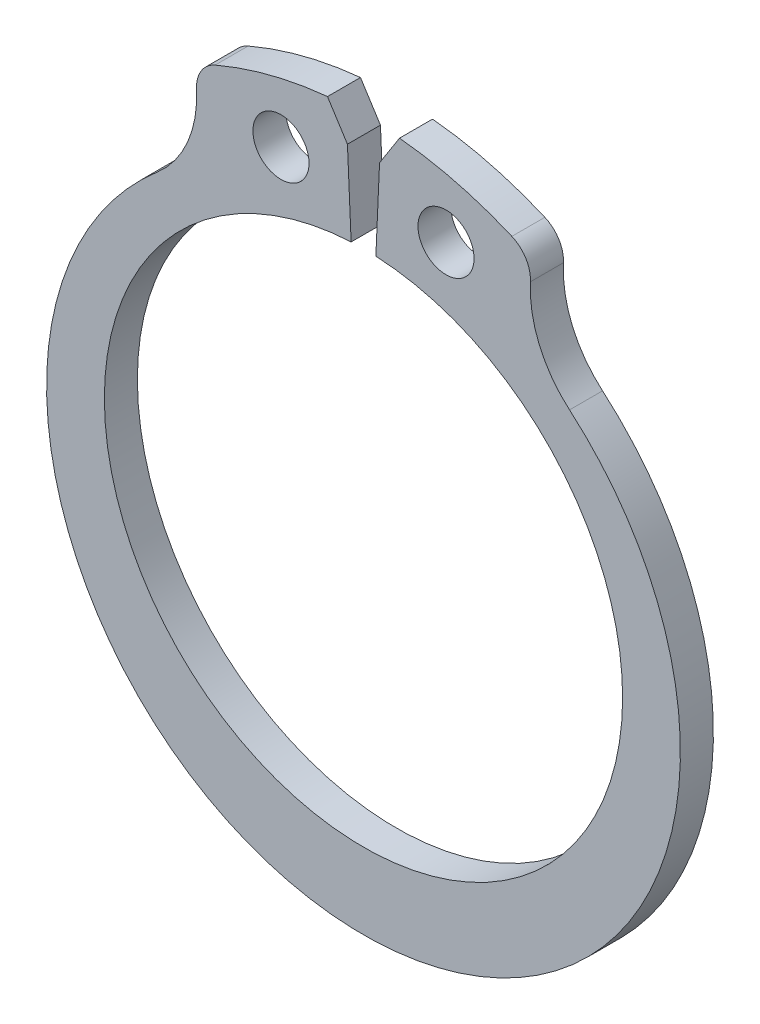
ISO-10303-21;
HEADER;
FILE_DESCRIPTION(('STEP AP214'),'2;1');
FILE_NAME('part.step','',(''),(''),'','','');
FILE_SCHEMA(('AUTOMOTIVE_DESIGN { 1 0 10303 214 1 1 1 1 }'));
ENDSEC;
DATA;
#1=APPLICATION_CONTEXT('core data for automotive mechanical design processes');
#2=APPLICATION_PROTOCOL_DEFINITION('international standard','automotive_design',2000,#1);
#3=PRODUCT_CONTEXT('',#1,'mechanical');
#4=PRODUCT('Part','Part','',(#3));
#5=PRODUCT_RELATED_PRODUCT_CATEGORY('part','',(#4));
#6=PRODUCT_DEFINITION_FORMATION('','',#4);
#7=PRODUCT_DEFINITION_CONTEXT('part definition',#1,'design');
#8=PRODUCT_DEFINITION('design','',#6,#7);
#9=PRODUCT_DEFINITION_SHAPE('','',#8);
#10=(LENGTH_UNIT() NAMED_UNIT(*) SI_UNIT(.MILLI.,.METRE.));
#11=(NAMED_UNIT(*) PLANE_ANGLE_UNIT() SI_UNIT($,.RADIAN.));
#12=(NAMED_UNIT(*) SI_UNIT($,.STERADIAN.) SOLID_ANGLE_UNIT());
#13=UNCERTAINTY_MEASURE_WITH_UNIT(LENGTH_MEASURE(1.E-05),#10,'distance_accuracy_value','');
#14=(GEOMETRIC_REPRESENTATION_CONTEXT(3) GLOBAL_UNCERTAINTY_ASSIGNED_CONTEXT((#13)) GLOBAL_UNIT_ASSIGNED_CONTEXT((#10,
#11,#12)) REPRESENTATION_CONTEXT('',''));
#15=CARTESIAN_POINT('',(0.,0.,0.));
#16=DIRECTION('',(0.,0.,1.));
#17=DIRECTION('',(1.,0.,0.));
#18=AXIS2_PLACEMENT_3D('',#15,#16,#17);
#19=CARTESIAN_POINT('',(3.58737884970706,0.376444434341003,1.));
#20=DIRECTION('',(0.,0.,1.));
#21=DIRECTION('',(1.,0.,0.));
#22=AXIS2_PLACEMENT_3D('',#19,#20,#21);
#23=PLANE('',#22);
#24=CARTESIAN_POINT('',(2.5,9.268764750494,1.));
#25=DIRECTION('',(0.,0.,-1.));
#26=DIRECTION('',(1.,0.,0.));
#27=AXIS2_PLACEMENT_3D('',#24,#25,#26);
#28=CIRCLE('',#27,0.85);
#29=CARTESIAN_POINT('',(1.65,9.268764750494,1.));
#30=VERTEX_POINT('',#29);
#31=EDGE_CURVE('E46',#30,#30,#28,.T.);
#32=ORIENTED_EDGE('',*,*,#31,.T.);
#33=EDGE_LOOP('',(#32));
#34=FACE_BOUND('',#33,.T.);
#35=CARTESIAN_POINT('',(-2.5,9.268764750494,1.));
#36=DIRECTION('',(0.,0.,-1.));
#37=DIRECTION('',(-1.,0.,0.));
#38=AXIS2_PLACEMENT_3D('',#35,#36,#37);
#39=CIRCLE('',#38,0.85);
#40=CARTESIAN_POINT('',(-1.65,9.268764750494,1.));
#41=VERTEX_POINT('',#40);
#42=EDGE_CURVE('E173',#41,#41,#39,.T.);
#43=ORIENTED_EDGE('',*,*,#42,.T.);
#44=EDGE_LOOP('',(#43));
#45=FACE_BOUND('',#44,.T.);
#46=CARTESIAN_POINT('',(0.,0.,1.));
#47=DIRECTION('',(0.,0.,-1.));
#48=DIRECTION('',(1.,0.,0.));
#49=AXIS2_PLACEMENT_3D('',#46,#47,#48);
#50=CIRCLE('',#49,7.85);
#51=CARTESIAN_POINT('',(0.374496199068514,7.84106195593959,1.));
#52=VERTEX_POINT('',#51);
#53=CARTESIAN_POINT('',(-0.374496199068514,7.84106195593959,1.));
#54=VERTEX_POINT('',#53);
#55=EDGE_CURVE('E150',#52,#54,#50,.T.);
#56=ORIENTED_EDGE('',*,*,#55,.T.);
#57=DIRECTION('',(-0.0445859872611464,0.999005550404976,0.));
#58=VECTOR('',#57,1.);
#59=CARTESIAN_POINT('',(0.,-0.55,1.));
#60=LINE('',#59,#58);
#61=CARTESIAN_POINT('',(-0.486471032067326,10.35,1.));
#62=VERTEX_POINT('',#61);
#63=EDGE_CURVE('E137',#54,#62,#60,.T.);
#64=ORIENTED_EDGE('',*,*,#63,.T.);
#65=DIRECTION('',(-0.53811537282345,0.842871191541792,0.));
#66=VECTOR('',#65,1.);
#67=CARTESIAN_POINT('',(-0.486471032067326,10.35,1.));
#68=LINE('',#67,#66);
#69=CARTESIAN_POINT('',(-1.09132810973727,11.2974113387491,1.));
#70=VERTEX_POINT('',#69);
#71=EDGE_CURVE('E66',#62,#70,#68,.T.);
#72=ORIENTED_EDGE('',*,*,#71,.T.);
#73=CARTESIAN_POINT('',(0.,0.,1.));
#74=DIRECTION('',(0.,0.,-1.));
#75=DIRECTION('',(-1.,0.,0.));
#76=AXIS2_PLACEMENT_3D('',#73,#74,#75);
#77=CIRCLE('',#76,11.35);
#78=CARTESIAN_POINT('',(-4.49406741142332,10.4223729592441,1.));
#79=VERTEX_POINT('',#78);
#80=EDGE_CURVE('E206',#79,#70,#77,.T.);
#81=ORIENTED_EDGE('',*,*,#80,.F.);
#82=CARTESIAN_POINT('',(-4.12385128546025,9.56378981238127,1.));
#83=DIRECTION('',(0.,0.,-1.));
#84=DIRECTION('',(-1.,0.,0.));
#85=AXIS2_PLACEMENT_3D('',#82,#83,#84);
#86=CIRCLE('',#85,0.935);
#87=CARTESIAN_POINT('',(-5.05745661579865,9.51273996258983,1.));
#88=VERTEX_POINT('',#87);
#89=EDGE_CURVE('E165',#88,#79,#86,.T.);
#90=ORIENTED_EDGE('',*,*,#89,.F.);
#91=CARTESIAN_POINT('',(-8.45238508975646,9.32710414516637,1.));
#92=DIRECTION('',(0.,0.,-1.));
#93=DIRECTION('',(-1.,0.,0.));
#94=AXIS2_PLACEMENT_3D('',#91,#92,#93);
#95=CIRCLE('',#94,3.4);
#96=CARTESIAN_POINT('',(-6.24176129705093,6.74386152258439,1.));
#97=VERTEX_POINT('',#96);
#98=EDGE_CURVE('E164',#88,#97,#95,.T.);
#99=ORIENTED_EDGE('',*,*,#98,.T.);
#100=CARTESIAN_POINT('',(0.,-0.55,1.));
#101=DIRECTION('',(0.,0.,-1.));
#102=DIRECTION('',(1.,0.,0.));
#103=AXIS2_PLACEMENT_3D('',#100,#101,#102);
#104=CIRCLE('',#103,9.6);
#105=CARTESIAN_POINT('',(6.24176129705093,6.74386152258439,1.));
#106=VERTEX_POINT('',#105);
#107=EDGE_CURVE('E11',#106,#97,#104,.T.);
#108=ORIENTED_EDGE('',*,*,#107,.F.);
#109=CARTESIAN_POINT('',(8.45238508975646,9.32710414516637,1.));
#110=DIRECTION('',(0.,0.,1.));
#111=DIRECTION('',(1.,0.,0.));
#112=AXIS2_PLACEMENT_3D('',#109,#110,#111);
#113=CIRCLE('',#112,3.4);
#114=CARTESIAN_POINT('',(5.05745661579865,9.51273996258983,1.));
#115=VERTEX_POINT('',#114);
#116=EDGE_CURVE('E166',#115,#106,#113,.T.);
#117=ORIENTED_EDGE('',*,*,#116,.F.);
#118=CARTESIAN_POINT('',(4.12385128546025,9.56378981238127,1.));
#119=DIRECTION('',(0.,0.,-1.));
#120=DIRECTION('',(1.,0.,0.));
#121=AXIS2_PLACEMENT_3D('',#118,#119,#120);
#122=CIRCLE('',#121,0.935);
#123=CARTESIAN_POINT('',(4.49406741142332,10.4223729592441,1.));
#124=VERTEX_POINT('',#123);
#125=EDGE_CURVE('E197',#124,#115,#122,.T.);
#126=ORIENTED_EDGE('',*,*,#125,.F.);
#127=CARTESIAN_POINT('',(0.,0.,1.));
#128=DIRECTION('',(0.,0.,-1.));
#129=DIRECTION('',(1.,0.,0.));
#130=AXIS2_PLACEMENT_3D('',#127,#128,#129);
#131=CIRCLE('',#130,11.35);
#132=CARTESIAN_POINT('',(1.09132810973727,11.2974113387491,1.));
#133=VERTEX_POINT('',#132);
#134=EDGE_CURVE('E205',#133,#124,#131,.T.);
#135=ORIENTED_EDGE('',*,*,#134,.F.);
#136=DIRECTION('',(0.53811537282345,0.842871191541792,0.));
#137=VECTOR('',#136,1.);
#138=CARTESIAN_POINT('',(0.486471032067326,10.35,1.));
#139=LINE('',#138,#137);
#140=CARTESIAN_POINT('',(0.486471032067326,10.35,1.));
#141=VERTEX_POINT('',#140);
#142=EDGE_CURVE('E157',#141,#133,#139,.T.);
#143=ORIENTED_EDGE('',*,*,#142,.F.);
#144=DIRECTION('',(0.0445859872611464,0.999005550404976,0.));
#145=VECTOR('',#144,1.);
#146=CARTESIAN_POINT('',(0.,-0.55,1.));
#147=LINE('',#146,#145);
#148=EDGE_CURVE('E158',#52,#141,#147,.T.);
#149=ORIENTED_EDGE('',*,*,#148,.F.);
#150=EDGE_LOOP('',(#56,#64,#72,#81,#90,#99,#108,#117,#126,#135,#143,#149));
#151=FACE_BOUND('',#150,.T.);
#152=ADVANCED_FACE('F17',(#34,#45,#151),#23,.T.);
#153=CARTESIAN_POINT('',(0.,-0.55,0.));
#154=DIRECTION('',(0.,0.,-1.));
#155=DIRECTION('',(1.,0.,0.));
#156=AXIS2_PLACEMENT_3D('',#153,#154,#155);
#157=CYLINDRICAL_SURFACE('',#156,9.6);
#158=ORIENTED_EDGE('',*,*,#107,.T.);
#159=DIRECTION('',(0.,0.,-1.));
#160=VECTOR('',#159,1.);
#161=CARTESIAN_POINT('',(-6.24176129705093,6.74386152258439,1.));
#162=LINE('',#161,#160);
#163=CARTESIAN_POINT('',(-6.24176129705093,6.74386152258439,0.));
#164=VERTEX_POINT('',#163);
#165=EDGE_CURVE('E162',#97,#164,#162,.T.);
#166=ORIENTED_EDGE('',*,*,#165,.T.);
#167=CARTESIAN_POINT('',(0.,-0.55,0.));
#168=DIRECTION('',(0.,0.,1.));
#169=DIRECTION('',(1.,0.,0.));
#170=AXIS2_PLACEMENT_3D('',#167,#168,#169);
#171=CIRCLE('',#170,9.6);
#172=CARTESIAN_POINT('',(6.24176129705093,6.74386152258439,0.));
#173=VERTEX_POINT('',#172);
#174=EDGE_CURVE('E223',#164,#173,#171,.T.);
#175=ORIENTED_EDGE('',*,*,#174,.T.);
#176=DIRECTION('',(0.,0.,1.));
#177=VECTOR('',#176,1.);
#178=CARTESIAN_POINT('',(6.24176129705093,6.74386152258439,0.));
#179=LINE('',#178,#177);
#180=EDGE_CURVE('E27',#173,#106,#179,.T.);
#181=ORIENTED_EDGE('',*,*,#180,.T.);
#182=EDGE_LOOP('',(#158,#166,#175,#181));
#183=FACE_BOUND('',#182,.T.);
#184=ADVANCED_FACE('F251',(#183),#157,.T.);
#185=CARTESIAN_POINT('',(8.45238508975646,9.32710414516637,0.));
#186=DIRECTION('',(0.,0.,-1.));
#187=DIRECTION('',(1.,0.,0.));
#188=AXIS2_PLACEMENT_3D('',#185,#186,#187);
#189=CYLINDRICAL_SURFACE('',#188,3.4);
#190=ORIENTED_EDGE('',*,*,#116,.T.);
#191=ORIENTED_EDGE('',*,*,#180,.F.);
#192=CARTESIAN_POINT('',(8.45238508975646,9.32710414516637,0.));
#193=DIRECTION('',(0.,0.,1.));
#194=DIRECTION('',(1.,0.,0.));
#195=AXIS2_PLACEMENT_3D('',#192,#193,#194);
#196=CIRCLE('',#195,3.4);
#197=CARTESIAN_POINT('',(5.05745661579865,9.51273996258983,0.));
#198=VERTEX_POINT('',#197);
#199=EDGE_CURVE('E183',#198,#173,#196,.T.);
#200=ORIENTED_EDGE('',*,*,#199,.F.);
#201=DIRECTION('',(0.,0.,1.));
#202=VECTOR('',#201,1.);
#203=CARTESIAN_POINT('',(5.05745661579865,9.51273996258983,0.));
#204=LINE('',#203,#202);
#205=EDGE_CURVE('E169',#198,#115,#204,.T.);
#206=ORIENTED_EDGE('',*,*,#205,.T.);
#207=EDGE_LOOP('',(#190,#191,#200,#206));
#208=FACE_BOUND('',#207,.T.);
#209=ADVANCED_FACE('F247',(#208),#189,.F.);
#210=CARTESIAN_POINT('',(4.12385128546025,9.56378981238127,0.));
#211=DIRECTION('',(0.,0.,-1.));
#212=DIRECTION('',(1.,0.,0.));
#213=AXIS2_PLACEMENT_3D('',#210,#211,#212);
#214=CYLINDRICAL_SURFACE('',#213,0.935);
#215=ORIENTED_EDGE('',*,*,#125,.T.);
#216=ORIENTED_EDGE('',*,*,#205,.F.);
#217=CARTESIAN_POINT('',(4.12385128546025,9.56378981238127,0.));
#218=DIRECTION('',(0.,0.,1.));
#219=DIRECTION('',(1.,0.,0.));
#220=AXIS2_PLACEMENT_3D('',#217,#218,#219);
#221=CIRCLE('',#220,0.935);
#222=CARTESIAN_POINT('',(4.49406741142332,10.4223729592441,0.));
#223=VERTEX_POINT('',#222);
#224=EDGE_CURVE('E180',#198,#223,#221,.T.);
#225=ORIENTED_EDGE('',*,*,#224,.T.);
#226=DIRECTION('',(0.,0.,1.));
#227=VECTOR('',#226,1.);
#228=CARTESIAN_POINT('',(4.49406741142332,10.4223729592441,0.));
#229=LINE('',#228,#227);
#230=EDGE_CURVE('E154',#223,#124,#229,.T.);
#231=ORIENTED_EDGE('',*,*,#230,.T.);
#232=EDGE_LOOP('',(#215,#216,#225,#231));
#233=FACE_BOUND('',#232,.T.);
#234=ADVANCED_FACE('F244',(#233),#214,.T.);
#235=CARTESIAN_POINT('',(0.,0.,0.));
#236=DIRECTION('',(0.,0.,-1.));
#237=DIRECTION('',(1.,0.,0.));
#238=AXIS2_PLACEMENT_3D('',#235,#236,#237);
#239=CYLINDRICAL_SURFACE('',#238,11.35);
#240=ORIENTED_EDGE('',*,*,#134,.T.);
#241=ORIENTED_EDGE('',*,*,#230,.F.);
#242=CARTESIAN_POINT('',(0.,0.,0.));
#243=DIRECTION('',(0.,0.,1.));
#244=DIRECTION('',(1.,0.,0.));
#245=AXIS2_PLACEMENT_3D('',#242,#243,#244);
#246=CIRCLE('',#245,11.35);
#247=CARTESIAN_POINT('',(1.09132810973727,11.2974113387491,0.));
#248=VERTEX_POINT('',#247);
#249=EDGE_CURVE('E184',#223,#248,#246,.T.);
#250=ORIENTED_EDGE('',*,*,#249,.T.);
#251=DIRECTION('',(0.,0.,1.));
#252=VECTOR('',#251,1.);
#253=CARTESIAN_POINT('',(1.09132810973727,11.2974113387491,0.));
#254=LINE('',#253,#252);
#255=EDGE_CURVE('E202',#248,#133,#254,.T.);
#256=ORIENTED_EDGE('',*,*,#255,.T.);
#257=EDGE_LOOP('',(#240,#241,#250,#256));
#258=FACE_BOUND('',#257,.T.);
#259=ADVANCED_FACE('F243',(#258),#239,.T.);
#260=CARTESIAN_POINT('',(0.788899570902296,10.8237056693746,0.));
#261=DIRECTION('',(-0.842871191541792,0.53811537282345,0.));
#262=DIRECTION('',(-0.53811537282345,-0.842871191541792,0.));
#263=AXIS2_PLACEMENT_3D('',#260,#261,#262);
#264=PLANE('',#263);
#265=ORIENTED_EDGE('',*,*,#142,.T.);
#266=ORIENTED_EDGE('',*,*,#255,.F.);
#267=DIRECTION('',(0.53811537282345,0.842871191541792,0.));
#268=VECTOR('',#267,1.);
#269=CARTESIAN_POINT('',(0.486471032067326,10.35,0.));
#270=LINE('',#269,#268);
#271=CARTESIAN_POINT('',(0.486471032067326,10.35,0.));
#272=VERTEX_POINT('',#271);
#273=EDGE_CURVE('E136',#272,#248,#270,.T.);
#274=ORIENTED_EDGE('',*,*,#273,.F.);
#275=DIRECTION('',(0.,0.,1.));
#276=VECTOR('',#275,1.);
#277=CARTESIAN_POINT('',(0.486471032067326,10.35,0.));
#278=LINE('',#277,#276);
#279=EDGE_CURVE('E133',#272,#141,#278,.T.);
#280=ORIENTED_EDGE('',*,*,#279,.T.);
#281=EDGE_LOOP('',(#265,#266,#274,#280));
#282=FACE_BOUND('',#281,.T.);
#283=ADVANCED_FACE('F239',(#282),#264,.T.);
#284=CARTESIAN_POINT('',(0.255508867760132,5.175,0.));
#285=DIRECTION('',(-0.999005550404976,0.0445859872611464,0.));
#286=DIRECTION('',(-0.0445859872611464,-0.999005550404976,0.));
#287=AXIS2_PLACEMENT_3D('',#284,#285,#286);
#288=PLANE('',#287);
#289=DIRECTION('',(0.,0.,1.));
#290=VECTOR('',#289,1.);
#291=CARTESIAN_POINT('',(0.374496199068514,7.84106195593959,0.5));
#292=LINE('',#291,#290);
#293=CARTESIAN_POINT('',(0.374496199068514,7.84106195593959,0.));
#294=VERTEX_POINT('',#293);
#295=EDGE_CURVE('E131',#294,#52,#292,.T.);
#296=ORIENTED_EDGE('',*,*,#295,.T.);
#297=ORIENTED_EDGE('',*,*,#148,.T.);
#298=ORIENTED_EDGE('',*,*,#279,.F.);
#299=DIRECTION('',(0.0445859872611464,0.999005550404976,0.));
#300=VECTOR('',#299,1.);
#301=CARTESIAN_POINT('',(0.,-0.55,0.));
#302=LINE('',#301,#300);
#303=EDGE_CURVE('E126',#294,#272,#302,.T.);
#304=ORIENTED_EDGE('',*,*,#303,.F.);
#305=EDGE_LOOP('',(#296,#297,#298,#304));
#306=FACE_BOUND('',#305,.T.);
#307=ADVANCED_FACE('F128',(#306),#288,.T.);
#308=CARTESIAN_POINT('',(2.5,9.268764750494,0.5));
#309=DIRECTION('',(0.,0.,-1.));
#310=DIRECTION('',(1.,0.,0.));
#311=AXIS2_PLACEMENT_3D('',#308,#309,#310);
#312=CYLINDRICAL_SURFACE('',#311,0.85);
#313=ORIENTED_EDGE('',*,*,#31,.F.);
#314=EDGE_LOOP('',(#313));
#315=FACE_BOUND('',#314,.T.);
#316=CARTESIAN_POINT('',(2.5,9.268764750494,0.));
#317=DIRECTION('',(0.,0.,1.));
#318=DIRECTION('',(1.,0.,0.));
#319=AXIS2_PLACEMENT_3D('',#316,#317,#318);
#320=CIRCLE('',#319,0.85);
#321=CARTESIAN_POINT('',(1.65,9.268764750494,0.));
#322=VERTEX_POINT('',#321);
#323=EDGE_CURVE('E160',#322,#322,#320,.T.);
#324=ORIENTED_EDGE('',*,*,#323,.F.);
#325=EDGE_LOOP('',(#324));
#326=FACE_BOUND('',#325,.T.);
#327=ADVANCED_FACE('F256',(#315,#326),#312,.F.);
#328=CARTESIAN_POINT('',(-8.45238508975646,9.32710414516637,1.));
#329=DIRECTION('',(0.,0.,1.));
#330=DIRECTION('',(-1.,0.,0.));
#331=AXIS2_PLACEMENT_3D('',#328,#329,#330);
#332=CYLINDRICAL_SURFACE('',#331,3.4);
#333=CARTESIAN_POINT('',(-8.45238508975646,9.32710414516637,0.));
#334=DIRECTION('',(0.,0.,-1.));
#335=DIRECTION('',(-1.,0.,0.));
#336=AXIS2_PLACEMENT_3D('',#333,#334,#335);
#337=CIRCLE('',#336,3.4);
#338=CARTESIAN_POINT('',(-5.05745661579865,9.51273996258983,0.));
#339=VERTEX_POINT('',#338);
#340=EDGE_CURVE('E201',#339,#164,#337,.T.);
#341=ORIENTED_EDGE('',*,*,#340,.T.);
#342=ORIENTED_EDGE('',*,*,#165,.F.);
#343=ORIENTED_EDGE('',*,*,#98,.F.);
#344=DIRECTION('',(0.,0.,-1.));
#345=VECTOR('',#344,1.);
#346=CARTESIAN_POINT('',(-5.05745661579865,9.51273996258983,1.));
#347=LINE('',#346,#345);
#348=EDGE_CURVE('E175',#88,#339,#347,.T.);
#349=ORIENTED_EDGE('',*,*,#348,.T.);
#350=EDGE_LOOP('',(#341,#342,#343,#349));
#351=FACE_BOUND('',#350,.T.);
#352=ADVANCED_FACE('F253',(#351),#332,.F.);
#353=CARTESIAN_POINT('',(-4.12385128546025,9.56378981238127,1.));
#354=DIRECTION('',(0.,0.,1.));
#355=DIRECTION('',(-1.,0.,0.));
#356=AXIS2_PLACEMENT_3D('',#353,#354,#355);
#357=CYLINDRICAL_SURFACE('',#356,0.935);
#358=CARTESIAN_POINT('',(-4.12385128546025,9.56378981238127,0.));
#359=DIRECTION('',(0.,0.,1.));
#360=DIRECTION('',(-1.,0.,0.));
#361=AXIS2_PLACEMENT_3D('',#358,#359,#360);
#362=CIRCLE('',#361,0.935);
#363=CARTESIAN_POINT('',(-4.49406741142332,10.4223729592441,0.));
#364=VERTEX_POINT('',#363);
#365=EDGE_CURVE('E194',#364,#339,#362,.T.);
#366=ORIENTED_EDGE('',*,*,#365,.T.);
#367=ORIENTED_EDGE('',*,*,#348,.F.);
#368=ORIENTED_EDGE('',*,*,#89,.T.);
#369=DIRECTION('',(0.,0.,-1.));
#370=VECTOR('',#369,1.);
#371=CARTESIAN_POINT('',(-4.49406741142332,10.4223729592441,1.));
#372=LINE('',#371,#370);
#373=EDGE_CURVE('E186',#79,#364,#372,.T.);
#374=ORIENTED_EDGE('',*,*,#373,.T.);
#375=EDGE_LOOP('',(#366,#367,#368,#374));
#376=FACE_BOUND('',#375,.T.);
#377=ADVANCED_FACE('F255',(#376),#357,.T.);
#378=CARTESIAN_POINT('',(0.,0.,1.));
#379=DIRECTION('',(0.,0.,1.));
#380=DIRECTION('',(-1.,0.,0.));
#381=AXIS2_PLACEMENT_3D('',#378,#379,#380);
#382=CYLINDRICAL_SURFACE('',#381,11.35);
#383=CARTESIAN_POINT('',(0.,0.,0.));
#384=DIRECTION('',(0.,0.,1.));
#385=DIRECTION('',(-1.,0.,0.));
#386=AXIS2_PLACEMENT_3D('',#383,#384,#385);
#387=CIRCLE('',#386,11.35);
#388=CARTESIAN_POINT('',(-1.09132810973727,11.2974113387491,0.));
#389=VERTEX_POINT('',#388);
#390=EDGE_CURVE('E161',#389,#364,#387,.T.);
#391=ORIENTED_EDGE('',*,*,#390,.T.);
#392=ORIENTED_EDGE('',*,*,#373,.F.);
#393=ORIENTED_EDGE('',*,*,#80,.T.);
#394=DIRECTION('',(0.,0.,-1.));
#395=VECTOR('',#394,1.);
#396=CARTESIAN_POINT('',(-1.09132810973727,11.2974113387491,1.));
#397=LINE('',#396,#395);
#398=EDGE_CURVE('E178',#70,#389,#397,.T.);
#399=ORIENTED_EDGE('',*,*,#398,.T.);
#400=EDGE_LOOP('',(#391,#392,#393,#399));
#401=FACE_BOUND('',#400,.T.);
#402=ADVANCED_FACE('F19',(#401),#382,.T.);
#403=CARTESIAN_POINT('',(-0.788899570902296,10.8237056693746,1.));
#404=DIRECTION('',(0.842871191541792,0.53811537282345,0.));
#405=DIRECTION('',(0.53811537282345,-0.842871191541792,0.));
#406=AXIS2_PLACEMENT_3D('',#403,#404,#405);
#407=PLANE('',#406);
#408=DIRECTION('',(-0.53811537282345,0.842871191541792,0.));
#409=VECTOR('',#408,1.);
#410=CARTESIAN_POINT('',(-0.486471032067325,10.35,0.));
#411=LINE('',#410,#409);
#412=CARTESIAN_POINT('',(-0.486471032067325,10.35,0.));
#413=VERTEX_POINT('',#412);
#414=EDGE_CURVE('E77',#413,#389,#411,.T.);
#415=ORIENTED_EDGE('',*,*,#414,.T.);
#416=ORIENTED_EDGE('',*,*,#398,.F.);
#417=ORIENTED_EDGE('',*,*,#71,.F.);
#418=DIRECTION('',(0.,0.,-1.));
#419=VECTOR('',#418,1.);
#420=CARTESIAN_POINT('',(-0.486471032067326,10.35,1.));
#421=LINE('',#420,#419);
#422=EDGE_CURVE('E189',#62,#413,#421,.T.);
#423=ORIENTED_EDGE('',*,*,#422,.T.);
#424=EDGE_LOOP('',(#415,#416,#417,#423));
#425=FACE_BOUND('',#424,.T.);
#426=ADVANCED_FACE('F288',(#425),#407,.T.);
#427=CARTESIAN_POINT('',(-2.5,9.268764750494,0.5));
#428=DIRECTION('',(0.,0.,1.));
#429=DIRECTION('',(-1.,0.,0.));
#430=AXIS2_PLACEMENT_3D('',#427,#428,#429);
#431=CYLINDRICAL_SURFACE('',#430,0.85);
#432=CARTESIAN_POINT('',(-2.5,9.268764750494,0.));
#433=DIRECTION('',(0.,0.,1.));
#434=DIRECTION('',(-1.,0.,0.));
#435=AXIS2_PLACEMENT_3D('',#432,#433,#434);
#436=CIRCLE('',#435,0.85);
#437=CARTESIAN_POINT('',(-1.65,9.268764750494,0.));
#438=VERTEX_POINT('',#437);
#439=EDGE_CURVE('E171',#438,#438,#436,.T.);
#440=ORIENTED_EDGE('',*,*,#439,.F.);
#441=EDGE_LOOP('',(#440));
#442=FACE_BOUND('',#441,.T.);
#443=ORIENTED_EDGE('',*,*,#42,.F.);
#444=EDGE_LOOP('',(#443));
#445=FACE_BOUND('',#444,.T.);
#446=ADVANCED_FACE('F282',(#442,#445),#431,.F.);
#447=CARTESIAN_POINT('',(3.58737884970706,0.376444434341003,0.));
#448=DIRECTION('',(0.,0.,1.));
#449=DIRECTION('',(1.,0.,0.));
#450=AXIS2_PLACEMENT_3D('',#447,#448,#449);
#451=PLANE('',#450);
#452=ORIENTED_EDGE('',*,*,#439,.T.);
#453=EDGE_LOOP('',(#452));
#454=FACE_BOUND('',#453,.T.);
#455=ORIENTED_EDGE('',*,*,#323,.T.);
#456=EDGE_LOOP('',(#455));
#457=FACE_BOUND('',#456,.T.);
#458=CARTESIAN_POINT('',(0.,0.,0.));
#459=DIRECTION('',(0.,0.,1.));
#460=DIRECTION('',(1.,0.,0.));
#461=AXIS2_PLACEMENT_3D('',#458,#459,#460);
#462=CIRCLE('',#461,7.85);
#463=CARTESIAN_POINT('',(-0.374496199068514,7.84106195593959,0.));
#464=VERTEX_POINT('',#463);
#465=EDGE_CURVE('E21',#464,#294,#462,.T.);
#466=ORIENTED_EDGE('',*,*,#465,.T.);
#467=ORIENTED_EDGE('',*,*,#303,.T.);
#468=ORIENTED_EDGE('',*,*,#273,.T.);
#469=ORIENTED_EDGE('',*,*,#249,.F.);
#470=ORIENTED_EDGE('',*,*,#224,.F.);
#471=ORIENTED_EDGE('',*,*,#199,.T.);
#472=ORIENTED_EDGE('',*,*,#174,.F.);
#473=ORIENTED_EDGE('',*,*,#340,.F.);
#474=ORIENTED_EDGE('',*,*,#365,.F.);
#475=ORIENTED_EDGE('',*,*,#390,.F.);
#476=ORIENTED_EDGE('',*,*,#414,.F.);
#477=DIRECTION('',(-0.0445859872611464,0.999005550404976,0.));
#478=VECTOR('',#477,1.);
#479=CARTESIAN_POINT('',(0.,-0.55,0.));
#480=LINE('',#479,#478);
#481=EDGE_CURVE('E142',#464,#413,#480,.T.);
#482=ORIENTED_EDGE('',*,*,#481,.F.);
#483=EDGE_LOOP('',(#466,#467,#468,#469,#470,#471,#472,#473,#474,#475,#476,#482));
#484=FACE_BOUND('',#483,.T.);
#485=ADVANCED_FACE('F140',(#454,#457,#484),#451,.F.);
#486=CARTESIAN_POINT('',(-0.255508867760132,5.175,1.));
#487=DIRECTION('',(0.999005550404976,0.0445859872611464,0.));
#488=DIRECTION('',(0.0445859872611464,-0.999005550404976,0.));
#489=AXIS2_PLACEMENT_3D('',#486,#487,#488);
#490=PLANE('',#489);
#491=DIRECTION('',(0.,0.,-1.));
#492=VECTOR('',#491,1.);
#493=CARTESIAN_POINT('',(-0.374496199068514,7.84106195593959,0.5));
#494=LINE('',#493,#492);
#495=EDGE_CURVE('E146',#54,#464,#494,.T.);
#496=ORIENTED_EDGE('',*,*,#495,.T.);
#497=ORIENTED_EDGE('',*,*,#481,.T.);
#498=ORIENTED_EDGE('',*,*,#422,.F.);
#499=ORIENTED_EDGE('',*,*,#63,.F.);
#500=EDGE_LOOP('',(#496,#497,#498,#499));
#501=FACE_BOUND('',#500,.T.);
#502=ADVANCED_FACE('F236',(#501),#490,.T.);
#503=CARTESIAN_POINT('',(0.,0.,0.5));
#504=DIRECTION('',(0.,0.,-1.));
#505=DIRECTION('',(1.,0.,0.));
#506=AXIS2_PLACEMENT_3D('',#503,#504,#505);
#507=CYLINDRICAL_SURFACE('',#506,7.85);
#508=ORIENTED_EDGE('',*,*,#295,.F.);
#509=ORIENTED_EDGE('',*,*,#465,.F.);
#510=ORIENTED_EDGE('',*,*,#495,.F.);
#511=ORIENTED_EDGE('',*,*,#55,.F.);
#512=EDGE_LOOP('',(#508,#509,#510,#511));
#513=FACE_BOUND('',#512,.T.);
#514=ADVANCED_FACE('F148',(#513),#507,.F.);
#515=CLOSED_SHELL('',(#152,#184,#209,#234,#259,#283,#307,#327,#352,#377,#402,#426,#446,#485,
#502,#514));
#516=MANIFOLD_SOLID_BREP('B1',#515);
#517=ADVANCED_BREP_SHAPE_REPRESENTATION('',(#18,#516),#14);
#518=SHAPE_DEFINITION_REPRESENTATION(#9,#517);
ENDSEC;
END-ISO-10303-21;
